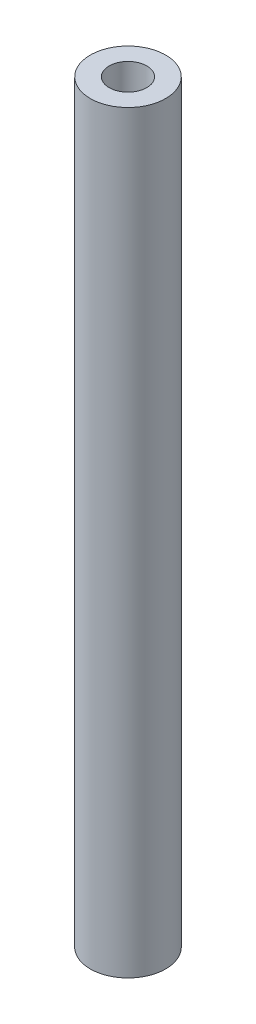
ISO-10303-21;
HEADER;
FILE_DESCRIPTION(('STEP AP214'),'2;1');
FILE_NAME('part.step','',(''),(''),'','','');
FILE_SCHEMA(('AUTOMOTIVE_DESIGN { 1 0 10303 214 1 1 1 1 }'));
ENDSEC;
DATA;
#1=APPLICATION_CONTEXT('core data for automotive mechanical design processes');
#2=APPLICATION_PROTOCOL_DEFINITION('international standard','automotive_design',2000,#1);
#3=PRODUCT_CONTEXT('',#1,'mechanical');
#4=PRODUCT('Part','Part','',(#3));
#5=PRODUCT_RELATED_PRODUCT_CATEGORY('part','',(#4));
#6=PRODUCT_DEFINITION_FORMATION('','',#4);
#7=PRODUCT_DEFINITION_CONTEXT('part definition',#1,'design');
#8=PRODUCT_DEFINITION('design','',#6,#7);
#9=PRODUCT_DEFINITION_SHAPE('','',#8);
#10=(LENGTH_UNIT() NAMED_UNIT(*) SI_UNIT(.MILLI.,.METRE.));
#11=(NAMED_UNIT(*) PLANE_ANGLE_UNIT() SI_UNIT($,.RADIAN.));
#12=(NAMED_UNIT(*) SI_UNIT($,.STERADIAN.) SOLID_ANGLE_UNIT());
#13=UNCERTAINTY_MEASURE_WITH_UNIT(LENGTH_MEASURE(1.E-05),#10,'distance_accuracy_value','');
#14=(GEOMETRIC_REPRESENTATION_CONTEXT(3) GLOBAL_UNCERTAINTY_ASSIGNED_CONTEXT((#13)) GLOBAL_UNIT_ASSIGNED_CONTEXT((#10,
#11,#12)) REPRESENTATION_CONTEXT('',''));
#15=CARTESIAN_POINT('',(0.,0.,0.));
#16=DIRECTION('',(0.,0.,1.));
#17=DIRECTION('',(1.,0.,0.));
#18=AXIS2_PLACEMENT_3D('',#15,#16,#17);
#19=CARTESIAN_POINT('',(0.,80.,0.));
#20=DIRECTION('',(0.,-1.,0.));
#21=DIRECTION('',(0.,0.,-1.));
#22=AXIS2_PLACEMENT_3D('',#19,#20,#21);
#23=CYLINDRICAL_SURFACE('',#22,4.);
#24=CARTESIAN_POINT('',(0.,80.,0.));
#25=DIRECTION('',(0.,1.,0.));
#26=DIRECTION('',(0.,0.,1.));
#27=AXIS2_PLACEMENT_3D('',#24,#25,#26);
#28=CIRCLE('',#27,4.);
#29=CARTESIAN_POINT('',(0.,80.,4.));
#30=VERTEX_POINT('',#29);
#31=EDGE_CURVE('E10',#30,#30,#28,.T.);
#32=ORIENTED_EDGE('',*,*,#31,.F.);
#33=EDGE_LOOP('',(#32));
#34=FACE_BOUND('',#33,.T.);
#35=CARTESIAN_POINT('',(0.,0.,0.));
#36=DIRECTION('',(0.,1.,0.));
#37=DIRECTION('',(0.,0.,1.));
#38=AXIS2_PLACEMENT_3D('',#35,#36,#37);
#39=CIRCLE('',#38,4.);
#40=CARTESIAN_POINT('',(0.,0.,4.));
#41=VERTEX_POINT('',#40);
#42=EDGE_CURVE('E35',#41,#41,#39,.T.);
#43=ORIENTED_EDGE('',*,*,#42,.T.);
#44=EDGE_LOOP('',(#43));
#45=FACE_BOUND('',#44,.T.);
#46=ADVANCED_FACE('F32',(#34,#45),#23,.T.);
#47=CARTESIAN_POINT('',(0.,80.,0.));
#48=DIRECTION('',(0.,1.,0.));
#49=DIRECTION('',(0.,0.,1.));
#50=AXIS2_PLACEMENT_3D('',#47,#48,#49);
#51=PLANE('',#50);
#52=CARTESIAN_POINT('',(0.,80.,0.));
#53=DIRECTION('',(0.,1.,0.));
#54=DIRECTION('',(0.,0.,1.));
#55=AXIS2_PLACEMENT_3D('',#52,#53,#54);
#56=CIRCLE('',#55,2.);
#57=CARTESIAN_POINT('',(0.,80.,2.));
#58=VERTEX_POINT('',#57);
#59=EDGE_CURVE('E44',#58,#58,#56,.T.);
#60=ORIENTED_EDGE('',*,*,#59,.F.);
#61=EDGE_LOOP('',(#60));
#62=FACE_BOUND('',#61,.T.);
#63=ORIENTED_EDGE('',*,*,#31,.T.);
#64=EDGE_LOOP('',(#63));
#65=FACE_BOUND('',#64,.T.);
#66=ADVANCED_FACE('F59',(#62,#65),#51,.T.);
#67=CARTESIAN_POINT('',(0.,0.,0.));
#68=DIRECTION('',(0.,1.,0.));
#69=DIRECTION('',(0.,0.,1.));
#70=AXIS2_PLACEMENT_3D('',#67,#68,#69);
#71=PLANE('',#70);
#72=CARTESIAN_POINT('',(0.,0.,0.));
#73=DIRECTION('',(0.,1.,0.));
#74=DIRECTION('',(0.,0.,1.));
#75=AXIS2_PLACEMENT_3D('',#72,#73,#74);
#76=CIRCLE('',#75,2.);
#77=CARTESIAN_POINT('',(0.,0.,2.));
#78=VERTEX_POINT('',#77);
#79=EDGE_CURVE('E42',#78,#78,#76,.T.);
#80=ORIENTED_EDGE('',*,*,#79,.T.);
#81=EDGE_LOOP('',(#80));
#82=FACE_BOUND('',#81,.T.);
#83=ORIENTED_EDGE('',*,*,#42,.F.);
#84=EDGE_LOOP('',(#83));
#85=FACE_BOUND('',#84,.T.);
#86=ADVANCED_FACE('F50',(#82,#85),#71,.F.);
#87=CARTESIAN_POINT('',(0.,0.,0.));
#88=DIRECTION('',(0.,1.,0.));
#89=DIRECTION('',(0.,0.,1.));
#90=AXIS2_PLACEMENT_3D('',#87,#88,#89);
#91=CYLINDRICAL_SURFACE('',#90,2.);
#92=ORIENTED_EDGE('',*,*,#79,.F.);
#93=EDGE_LOOP('',(#92));
#94=FACE_BOUND('',#93,.T.);
#95=ORIENTED_EDGE('',*,*,#59,.T.);
#96=EDGE_LOOP('',(#95));
#97=FACE_BOUND('',#96,.T.);
#98=ADVANCED_FACE('F53',(#94,#97),#91,.F.);
#99=CLOSED_SHELL('',(#46,#66,#86,#98));
#100=MANIFOLD_SOLID_BREP('B2',#99);
#101=ADVANCED_BREP_SHAPE_REPRESENTATION('',(#18,#100),#14);
#102=SHAPE_DEFINITION_REPRESENTATION(#9,#101);
ENDSEC;
END-ISO-10303-21;
